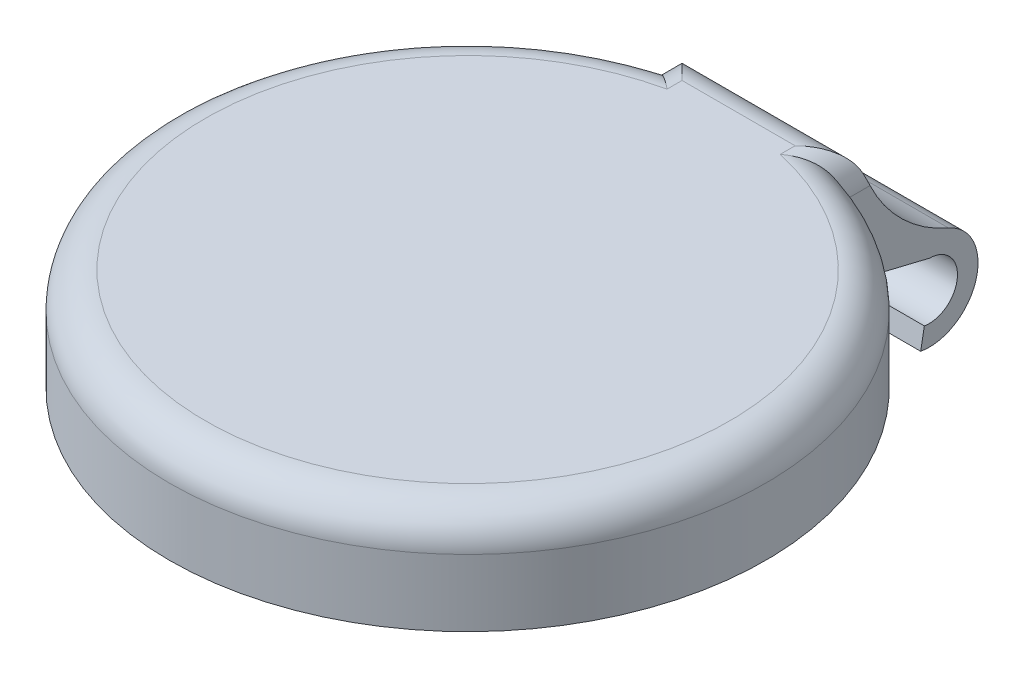
ISO-10303-21;
HEADER;
FILE_DESCRIPTION(('STEP AP214'),'2;1');
FILE_NAME('part.step','',(''),(''),'','','');
FILE_SCHEMA(('AUTOMOTIVE_DESIGN { 1 0 10303 214 1 1 1 1 }'));
ENDSEC;
DATA;
#1=APPLICATION_CONTEXT('core data for automotive mechanical design processes');
#2=APPLICATION_PROTOCOL_DEFINITION('international standard','automotive_design',2000,#1);
#3=PRODUCT_CONTEXT('',#1,'mechanical');
#4=PRODUCT('Part','Part','',(#3));
#5=PRODUCT_RELATED_PRODUCT_CATEGORY('part','',(#4));
#6=PRODUCT_DEFINITION_FORMATION('','',#4);
#7=PRODUCT_DEFINITION_CONTEXT('part definition',#1,'design');
#8=PRODUCT_DEFINITION('design','',#6,#7);
#9=PRODUCT_DEFINITION_SHAPE('','',#8);
#10=(LENGTH_UNIT() NAMED_UNIT(*) SI_UNIT(.MILLI.,.METRE.));
#11=(NAMED_UNIT(*) PLANE_ANGLE_UNIT() SI_UNIT($,.RADIAN.));
#12=(NAMED_UNIT(*) SI_UNIT($,.STERADIAN.) SOLID_ANGLE_UNIT());
#13=UNCERTAINTY_MEASURE_WITH_UNIT(LENGTH_MEASURE(1.E-05),#10,'distance_accuracy_value','');
#14=(GEOMETRIC_REPRESENTATION_CONTEXT(3) GLOBAL_UNCERTAINTY_ASSIGNED_CONTEXT((#13)) GLOBAL_UNIT_ASSIGNED_CONTEXT((#10,
#11,#12)) REPRESENTATION_CONTEXT('',''));
#15=CARTESIAN_POINT('',(0.,0.,0.));
#16=DIRECTION('',(0.,0.,1.));
#17=DIRECTION('',(1.,0.,0.));
#18=AXIS2_PLACEMENT_3D('',#15,#16,#17);
#19=CARTESIAN_POINT('',(0.,10.,0.));
#20=DIRECTION('',(0.,-1.,0.));
#21=DIRECTION('',(0.,0.,-1.));
#22=AXIS2_PLACEMENT_3D('',#19,#20,#21);
#23=CYLINDRICAL_SURFACE('',#22,29.);
#24=DIRECTION('',(0.,-1.,0.));
#25=VECTOR('',#24,1.);
#26=CARTESIAN_POINT('',(9.,10.,-27.5680975041804));
#27=LINE('',#26,#25);
#28=CARTESIAN_POINT('',(9.,6.5,-27.5680975041804));
#29=VERTEX_POINT('',#28);
#30=CARTESIAN_POINT('',(9.,0.,-27.5680975041804));
#31=VERTEX_POINT('',#30);
#32=EDGE_CURVE('E210',#29,#31,#27,.T.);
#33=ORIENTED_EDGE('',*,*,#32,.F.);
#34=CARTESIAN_POINT('',(0.,6.5,0.));
#35=DIRECTION('',(0.,1.,0.));
#36=DIRECTION('',(0.,0.,1.));
#37=AXIS2_PLACEMENT_3D('',#34,#35,#36);
#38=CIRCLE('',#37,29.);
#39=CARTESIAN_POINT('',(-9.,6.5,-27.5680975041804));
#40=VERTEX_POINT('',#39);
#41=EDGE_CURVE('E62',#29,#40,#38,.F.);
#42=ORIENTED_EDGE('',*,*,#41,.T.);
#43=DIRECTION('',(0.,-1.,0.));
#44=VECTOR('',#43,1.);
#45=CARTESIAN_POINT('',(-9.,10.,-27.5680975041804));
#46=LINE('',#45,#44);
#47=CARTESIAN_POINT('',(-9.,0.,-27.5680975041804));
#48=VERTEX_POINT('',#47);
#49=EDGE_CURVE('E207',#40,#48,#46,.T.);
#50=ORIENTED_EDGE('',*,*,#49,.T.);
#51=CARTESIAN_POINT('',(0.,0.,0.));
#52=DIRECTION('',(0.,1.,0.));
#53=DIRECTION('',(0.,0.,1.));
#54=AXIS2_PLACEMENT_3D('',#51,#52,#53);
#55=CIRCLE('',#54,29.);
#56=EDGE_CURVE('E166',#48,#31,#55,.T.);
#57=ORIENTED_EDGE('',*,*,#56,.T.);
#58=EDGE_LOOP('',(#33,#42,#50,#57));
#59=FACE_BOUND('',#58,.T.);
#60=ADVANCED_FACE('F53',(#59),#23,.T.);
#61=CARTESIAN_POINT('',(9.,10.,-27.5680975041804));
#62=DIRECTION('',(-1.,0.,0.));
#63=DIRECTION('',(0.,0.,1.));
#64=AXIS2_PLACEMENT_3D('',#61,#62,#63);
#65=PLANE('',#64);
#66=CARTESIAN_POINT('',(9.,12.8859859390079,-43.7197515318652));
#67=DIRECTION('',(-1.,0.,0.));
#68=DIRECTION('',(0.,0.,1.));
#69=AXIS2_PLACEMENT_3D('',#66,#67,#68);
#70=CIRCLE('',#69,15.);
#71=CARTESIAN_POINT('',(9.,-0.888180596947476,-37.7806997355119));
#72=VERTEX_POINT('',#71);
#73=CARTESIAN_POINT('',(9.,6.5,-30.1470147560048));
#74=VERTEX_POINT('',#73);
#75=EDGE_CURVE('E217',#72,#74,#70,.T.);
#76=ORIENTED_EDGE('',*,*,#75,.T.);
#77=DIRECTION('',(0.,0.,-1.));
#78=VECTOR('',#77,1.);
#79=CARTESIAN_POINT('',(9.,6.5,-27.5680975041804));
#80=LINE('',#79,#78);
#81=EDGE_CURVE('E69',#74,#29,#80,.F.);
#82=ORIENTED_EDGE('',*,*,#81,.T.);
#83=ORIENTED_EDGE('',*,*,#32,.T.);
#84=DIRECTION('',(0.,0.,-1.));
#85=VECTOR('',#84,1.);
#86=CARTESIAN_POINT('',(9.,0.,0.));
#87=LINE('',#86,#85);
#88=CARTESIAN_POINT('',(9.,0.,-25.5680975041804));
#89=VERTEX_POINT('',#88);
#90=EDGE_CURVE('E183',#89,#31,#87,.T.);
#91=ORIENTED_EDGE('',*,*,#90,.F.);
#92=DIRECTION('',(0.,0.235182080678678,0.971951330534429));
#93=VECTOR('',#92,1.);
#94=CARTESIAN_POINT('',(9.,5.84449727846342,-1.41418709691371));
#95=LINE('',#94,#93);
#96=CARTESIAN_POINT('',(9.,-2.5,-35.9));
#97=VERTEX_POINT('',#96);
#98=EDGE_CURVE('E157',#97,#89,#95,.T.);
#99=ORIENTED_EDGE('',*,*,#98,.F.);
#100=CARTESIAN_POINT('',(9.,-5.25,-35.9));
#101=DIRECTION('',(1.,0.,0.));
#102=DIRECTION('',(0.,0.,-1.));
#103=AXIS2_PLACEMENT_3D('',#100,#101,#102);
#104=CIRCLE('',#103,2.75);
#105=CARTESIAN_POINT('',(9.,-7.95822132078358,-35.422467511416));
#106=VERTEX_POINT('',#105);
#107=EDGE_CURVE('E189',#97,#106,#104,.F.);
#108=ORIENTED_EDGE('',*,*,#107,.T.);
#109=DIRECTION('',(0.,-0.98480775301221,0.173648177666921));
#110=VECTOR('',#109,1.);
#111=CARTESIAN_POINT('',(9.,-6.29756844313243,-35.715285419337));
#112=LINE('',#111,#110);
#113=CARTESIAN_POINT('',(9.,-9.927836826808,-35.0751711560821));
#114=VERTEX_POINT('',#113);
#115=EDGE_CURVE('E171',#106,#114,#112,.T.);
#116=ORIENTED_EDGE('',*,*,#115,.T.);
#117=CARTESIAN_POINT('',(9.,-5.25,-35.9));
#118=DIRECTION('',(1.,0.,0.));
#119=DIRECTION('',(0.,0.,-1.));
#120=AXIS2_PLACEMENT_3D('',#117,#118,#119);
#121=CIRCLE('',#120,4.75);
#122=EDGE_CURVE('E180',#72,#114,#121,.F.);
#123=ORIENTED_EDGE('',*,*,#122,.F.);
#124=EDGE_LOOP('',(#76,#82,#83,#91,#99,#108,#116,#123));
#125=FACE_BOUND('',#124,.T.);
#126=ADVANCED_FACE('F309',(#125),#65,.F.);
#127=CARTESIAN_POINT('',(-9.,10.,-27.5680975041804));
#128=DIRECTION('',(1.,0.,0.));
#129=DIRECTION('',(0.,0.,-1.));
#130=AXIS2_PLACEMENT_3D('',#127,#128,#129);
#131=PLANE('',#130);
#132=ORIENTED_EDGE('',*,*,#49,.F.);
#133=DIRECTION('',(0.,0.,1.));
#134=VECTOR('',#133,1.);
#135=CARTESIAN_POINT('',(-9.,6.5,-29.));
#136=LINE('',#135,#134);
#137=CARTESIAN_POINT('',(-9.,6.5,-30.1470147560048));
#138=VERTEX_POINT('',#137);
#139=EDGE_CURVE('E236',#40,#138,#136,.F.);
#140=ORIENTED_EDGE('',*,*,#139,.T.);
#141=CARTESIAN_POINT('',(-9.,12.8859859390079,-43.7197515318652));
#142=DIRECTION('',(1.,0.,0.));
#143=DIRECTION('',(0.,0.,-1.));
#144=AXIS2_PLACEMENT_3D('',#141,#142,#143);
#145=CIRCLE('',#144,15.);
#146=CARTESIAN_POINT('',(-9.,-0.888180596947476,-37.7806997355119));
#147=VERTEX_POINT('',#146);
#148=EDGE_CURVE('E220',#138,#147,#145,.T.);
#149=ORIENTED_EDGE('',*,*,#148,.T.);
#150=CARTESIAN_POINT('',(-9.,-5.25,-35.9));
#151=DIRECTION('',(1.,0.,0.));
#152=DIRECTION('',(0.,0.,-1.));
#153=AXIS2_PLACEMENT_3D('',#150,#151,#152);
#154=CIRCLE('',#153,4.75);
#155=CARTESIAN_POINT('',(-9.,-9.927836826808,-35.0751711560821));
#156=VERTEX_POINT('',#155);
#157=EDGE_CURVE('E168',#147,#156,#154,.F.);
#158=ORIENTED_EDGE('',*,*,#157,.T.);
#159=DIRECTION('',(0.,-0.98480775301221,0.173648177666921));
#160=VECTOR('',#159,1.);
#161=CARTESIAN_POINT('',(-9.,-6.29756844313243,-35.715285419337));
#162=LINE('',#161,#160);
#163=CARTESIAN_POINT('',(-9.,-7.95822132078358,-35.422467511416));
#164=VERTEX_POINT('',#163);
#165=EDGE_CURVE('E162',#164,#156,#162,.T.);
#166=ORIENTED_EDGE('',*,*,#165,.F.);
#167=CARTESIAN_POINT('',(-9.,-5.25,-35.9));
#168=DIRECTION('',(1.,0.,0.));
#169=DIRECTION('',(0.,0.,-1.));
#170=AXIS2_PLACEMENT_3D('',#167,#168,#169);
#171=CIRCLE('',#170,2.75);
#172=CARTESIAN_POINT('',(-9.,-2.5,-35.9));
#173=VERTEX_POINT('',#172);
#174=EDGE_CURVE('E148',#173,#164,#171,.F.);
#175=ORIENTED_EDGE('',*,*,#174,.F.);
#176=DIRECTION('',(0.,0.235182080678678,0.971951330534429));
#177=VECTOR('',#176,1.);
#178=CARTESIAN_POINT('',(-9.,5.84449727846342,-1.41418709691371));
#179=LINE('',#178,#177);
#180=CARTESIAN_POINT('',(-9.,0.,-25.5680975041804));
#181=VERTEX_POINT('',#180);
#182=EDGE_CURVE('E139',#173,#181,#179,.T.);
#183=ORIENTED_EDGE('',*,*,#182,.T.);
#184=DIRECTION('',(0.,0.,-1.));
#185=VECTOR('',#184,1.);
#186=CARTESIAN_POINT('',(-9.,0.,0.));
#187=LINE('',#186,#185);
#188=EDGE_CURVE('E144',#181,#48,#187,.T.);
#189=ORIENTED_EDGE('',*,*,#188,.T.);
#190=EDGE_LOOP('',(#132,#140,#149,#158,#166,#175,#183,#189));
#191=FACE_BOUND('',#190,.T.);
#192=ADVANCED_FACE('F142',(#191),#131,.F.);
#193=CARTESIAN_POINT('',(0.,10.,0.));
#194=DIRECTION('',(0.,1.,0.));
#195=DIRECTION('',(0.,0.,1.));
#196=AXIS2_PLACEMENT_3D('',#193,#194,#195);
#197=PLANE('',#196);
#198=DIRECTION('',(1.,0.,0.));
#199=VECTOR('',#198,1.);
#200=CARTESIAN_POINT('',(-9.,10.,-26.3568835779011));
#201=LINE('',#200,#199);
#202=CARTESIAN_POINT('',(5.5,10.,-26.3568835779011));
#203=VERTEX_POINT('',#202);
#204=CARTESIAN_POINT('',(-5.5,10.,-26.3568835779011));
#205=VERTEX_POINT('',#204);
#206=EDGE_CURVE('E229',#203,#205,#201,.F.);
#207=ORIENTED_EDGE('',*,*,#206,.T.);
#208=DIRECTION('',(0.,0.,1.));
#209=VECTOR('',#208,1.);
#210=CARTESIAN_POINT('',(-5.5,10.,-27.5680975041804));
#211=LINE('',#210,#209);
#212=CARTESIAN_POINT('',(-5.5,10.,-24.8997991959775));
#213=VERTEX_POINT('',#212);
#214=EDGE_CURVE('E232',#205,#213,#211,.T.);
#215=ORIENTED_EDGE('',*,*,#214,.T.);
#216=CARTESIAN_POINT('',(0.,10.,0.));
#217=DIRECTION('',(0.,1.,0.));
#218=DIRECTION('',(0.,0.,1.));
#219=AXIS2_PLACEMENT_3D('',#216,#217,#218);
#220=CIRCLE('',#219,25.5);
#221=CARTESIAN_POINT('',(5.5,10.,-24.8997991959775));
#222=VERTEX_POINT('',#221);
#223=EDGE_CURVE('E223',#213,#222,#220,.T.);
#224=ORIENTED_EDGE('',*,*,#223,.T.);
#225=DIRECTION('',(0.,0.,-1.));
#226=VECTOR('',#225,1.);
#227=CARTESIAN_POINT('',(5.5,10.,-29.));
#228=LINE('',#227,#226);
#229=EDGE_CURVE('E226',#222,#203,#228,.T.);
#230=ORIENTED_EDGE('',*,*,#229,.T.);
#231=EDGE_LOOP('',(#207,#215,#224,#230));
#232=FACE_BOUND('',#231,.T.);
#233=ADVANCED_FACE('F324',(#232),#197,.T.);
#234=CARTESIAN_POINT('',(0.,0.,0.));
#235=DIRECTION('',(0.,1.,0.));
#236=DIRECTION('',(0.,0.,1.));
#237=AXIS2_PLACEMENT_3D('',#234,#235,#236);
#238=PLANE('',#237);
#239=CARTESIAN_POINT('',(0.,0.,0.));
#240=DIRECTION('',(0.,-1.,0.));
#241=DIRECTION('',(0.,0.,-1.));
#242=AXIS2_PLACEMENT_3D('',#239,#240,#241);
#243=CIRCLE('',#242,24.);
#244=CARTESIAN_POINT('',(0.,0.,-24.));
#245=VERTEX_POINT('',#244);
#246=EDGE_CURVE('E285',#245,#245,#243,.T.);
#247=ORIENTED_EDGE('',*,*,#246,.F.);
#248=EDGE_LOOP('',(#247));
#249=FACE_BOUND('',#248,.T.);
#250=DIRECTION('',(1.,0.,0.));
#251=VECTOR('',#250,1.);
#252=CARTESIAN_POINT('',(-9.,0.,-25.5680975041804));
#253=LINE('',#252,#251);
#254=EDGE_CURVE('E154',#181,#89,#253,.T.);
#255=ORIENTED_EDGE('',*,*,#254,.T.);
#256=ORIENTED_EDGE('',*,*,#90,.T.);
#257=ORIENTED_EDGE('',*,*,#56,.F.);
#258=ORIENTED_EDGE('',*,*,#188,.F.);
#259=EDGE_LOOP('',(#255,#256,#257,#258));
#260=FACE_BOUND('',#259,.T.);
#261=ADVANCED_FACE('F164',(#249,#260),#238,.F.);
#262=CARTESIAN_POINT('',(-9.,-5.25,-35.9));
#263=DIRECTION('',(1.,0.,0.));
#264=DIRECTION('',(0.,0.,-1.));
#265=AXIS2_PLACEMENT_3D('',#262,#263,#264);
#266=CYLINDRICAL_SURFACE('',#265,4.75);
#267=ORIENTED_EDGE('',*,*,#157,.F.);
#268=DIRECTION('',(1.,0.,0.));
#269=VECTOR('',#268,1.);
#270=CARTESIAN_POINT('',(-9.,-0.888180596947476,-37.7806997355119));
#271=LINE('',#270,#269);
#272=EDGE_CURVE('E213',#147,#72,#271,.T.);
#273=ORIENTED_EDGE('',*,*,#272,.T.);
#274=ORIENTED_EDGE('',*,*,#122,.T.);
#275=DIRECTION('',(1.,0.,0.));
#276=VECTOR('',#275,1.);
#277=CARTESIAN_POINT('',(-9.,-9.927836826808,-35.0751711560821));
#278=LINE('',#277,#276);
#279=EDGE_CURVE('E196',#156,#114,#278,.T.);
#280=ORIENTED_EDGE('',*,*,#279,.F.);
#281=EDGE_LOOP('',(#267,#273,#274,#280));
#282=FACE_BOUND('',#281,.T.);
#283=ADVANCED_FACE('F314',(#282),#266,.T.);
#284=CARTESIAN_POINT('',(-9.,-6.29756844313243,-35.715285419337));
#285=DIRECTION('',(0.,0.173648177666921,0.98480775301221));
#286=DIRECTION('',(0.,-0.98480775301221,0.173648177666921));
#287=AXIS2_PLACEMENT_3D('',#284,#285,#286);
#288=PLANE('',#287);
#289=ORIENTED_EDGE('',*,*,#115,.F.);
#290=DIRECTION('',(1.,0.,0.));
#291=VECTOR('',#290,1.);
#292=CARTESIAN_POINT('',(-9.,-7.95822132078358,-35.422467511416));
#293=LINE('',#292,#291);
#294=EDGE_CURVE('E200',#164,#106,#293,.T.);
#295=ORIENTED_EDGE('',*,*,#294,.F.);
#296=ORIENTED_EDGE('',*,*,#165,.T.);
#297=ORIENTED_EDGE('',*,*,#279,.T.);
#298=EDGE_LOOP('',(#289,#295,#296,#297));
#299=FACE_BOUND('',#298,.T.);
#300=ADVANCED_FACE('F316',(#299),#288,.T.);
#301=CARTESIAN_POINT('',(-9.,-5.25,-35.9));
#302=DIRECTION('',(1.,0.,0.));
#303=DIRECTION('',(0.,0.,-1.));
#304=AXIS2_PLACEMENT_3D('',#301,#302,#303);
#305=CYLINDRICAL_SURFACE('',#304,2.75);
#306=ORIENTED_EDGE('',*,*,#107,.F.);
#307=DIRECTION('',(1.,0.,0.));
#308=VECTOR('',#307,1.);
#309=CARTESIAN_POINT('',(-9.,-2.5,-35.9));
#310=LINE('',#309,#308);
#311=EDGE_CURVE('E161',#173,#97,#310,.T.);
#312=ORIENTED_EDGE('',*,*,#311,.F.);
#313=ORIENTED_EDGE('',*,*,#174,.T.);
#314=ORIENTED_EDGE('',*,*,#294,.T.);
#315=EDGE_LOOP('',(#306,#312,#313,#314));
#316=FACE_BOUND('',#315,.T.);
#317=ADVANCED_FACE('F343',(#316),#305,.F.);
#318=CARTESIAN_POINT('',(-9.,5.84449727846342,-1.41418709691371));
#319=DIRECTION('',(0.,0.971951330534429,-0.235182080678678));
#320=DIRECTION('',(0.,0.235182080678678,0.971951330534429));
#321=AXIS2_PLACEMENT_3D('',#318,#319,#320);
#322=PLANE('',#321);
#323=ORIENTED_EDGE('',*,*,#98,.T.);
#324=ORIENTED_EDGE('',*,*,#254,.F.);
#325=ORIENTED_EDGE('',*,*,#182,.F.);
#326=ORIENTED_EDGE('',*,*,#311,.T.);
#327=EDGE_LOOP('',(#323,#324,#325,#326));
#328=FACE_BOUND('',#327,.T.);
#329=ADVANCED_FACE('F155',(#328),#322,.F.);
#330=CARTESIAN_POINT('',(-9.,12.8859859390079,-43.7197515318652));
#331=DIRECTION('',(-1.,0.,0.));
#332=DIRECTION('',(0.,0.,1.));
#333=AXIS2_PLACEMENT_3D('',#330,#331,#332);
#334=CYLINDRICAL_SURFACE('',#333,15.);
#335=ORIENTED_EDGE('',*,*,#148,.F.);
#336=CARTESIAN_POINT('',(-9.,6.5,-30.1470147560048));
#337=CARTESIAN_POINT('',(-9.00000840723424,6.60090979215177,-30.0995241486243));
#338=CARTESIAN_POINT('',(-8.99563506539931,6.70237845387515,-30.0531702472135));
#339=CARTESIAN_POINT('',(-8.97797204439329,6.90491441432685,-29.9633390619673));
#340=CARTESIAN_POINT('',(-8.96474780652322,7.0059792214118,-29.9198432198844));
#341=CARTESIAN_POINT('',(-8.92923434531926,7.20769704888034,-29.8356246855853));
#342=CARTESIAN_POINT('',(-8.90694421131473,7.3083500268694,-29.7949022724405));
#343=CARTESIAN_POINT('',(-8.85300321865056,7.50909644840812,-29.7161497918298));
#344=CARTESIAN_POINT('',(-8.82128460268405,7.60918030566861,-29.678141771393));
#345=CARTESIAN_POINT('',(-8.78486691020943,7.70815950197446,-29.6417504881106));
#346=B_SPLINE_CURVE_WITH_KNOTS('',3,(#336,#337,#338,#339,#340,#341,#342,#343,#344,#345),
.UNSPECIFIED.,.F.,.F.,(4,2,2,2,4),(0.,0.334517776748931,0.666589141559774,0.998693871230997,
1.33324545889248),.UNSPECIFIED.);
#347=CARTESIAN_POINT('',(-8.78486691020943,7.70815950197446,-29.6417504881106));
#348=VERTEX_POINT('',#347);
#349=EDGE_CURVE('E77',#138,#348,#346,.T.);
#350=ORIENTED_EDGE('',*,*,#349,.T.);
#351=DIRECTION('',(-1.,0.,0.));
#352=VECTOR('',#351,1.);
#353=CARTESIAN_POINT('',(-9.,7.70815950197446,-29.6417504881106));
#354=LINE('',#353,#352);
#355=CARTESIAN_POINT('',(8.78486691020943,7.70815950197446,-29.6417504881106));
#356=VERTEX_POINT('',#355);
#357=EDGE_CURVE('E249',#348,#356,#354,.F.);
#358=ORIENTED_EDGE('',*,*,#357,.T.);
#359=CARTESIAN_POINT('',(8.78486691020943,7.70815950197446,-29.6417504881106));
#360=CARTESIAN_POINT('',(8.82128460268405,7.60918030566861,-29.678141771393));
#361=CARTESIAN_POINT('',(8.85300321865056,7.50909644840812,-29.7161497918298));
#362=CARTESIAN_POINT('',(8.90694421131473,7.3083500268694,-29.7949022724405));
#363=CARTESIAN_POINT('',(8.92923434531926,7.20769704888034,-29.8356246855853));
#364=CARTESIAN_POINT('',(8.96474780652322,7.0059792214118,-29.9198432198844));
#365=CARTESIAN_POINT('',(8.97797204439329,6.90491441432685,-29.9633390619673));
#366=CARTESIAN_POINT('',(8.99563506539931,6.70237845387515,-30.0531702472135));
#367=CARTESIAN_POINT('',(9.00000840723424,6.60090979215177,-30.0995241486243));
#368=CARTESIAN_POINT('',(9.,6.5,-30.1470147560048));
#369=B_SPLINE_CURVE_WITH_KNOTS('',3,(#359,#360,#361,#362,#363,#364,#365,#366,#367,#368),
.UNSPECIFIED.,.F.,.F.,(4,2,2,2,4),(0.,0.334551587661482,0.666656317332709,0.998727682143552,
1.33324545889249),.UNSPECIFIED.);
#370=EDGE_CURVE('E240',#356,#74,#369,.T.);
#371=ORIENTED_EDGE('',*,*,#370,.T.);
#372=ORIENTED_EDGE('',*,*,#75,.F.);
#373=ORIENTED_EDGE('',*,*,#272,.F.);
#374=EDGE_LOOP('',(#335,#350,#358,#371,#372,#373));
#375=FACE_BOUND('',#374,.T.);
#376=ADVANCED_FACE('F254',(#375),#334,.F.);
#377=CARTESIAN_POINT('',(5.5,6.5,0.));
#378=DIRECTION('',(0.,0.,1.));
#379=DIRECTION('',(1.,0.,0.));
#380=AXIS2_PLACEMENT_3D('',#377,#378,#379);
#381=CYLINDRICAL_SURFACE('',#380,3.5);
#382=ORIENTED_EDGE('',*,*,#81,.F.);
#383=ORIENTED_EDGE('',*,*,#370,.F.);
#384=CARTESIAN_POINT('',(5.5,6.5,-26.3568835779011));
#385=DIRECTION('',(0.707106781186547,0.,0.707106781186547));
#386=DIRECTION('',(-0.707106781186547,0.,0.707106781186547));
#387=AXIS2_PLACEMENT_3D('',#384,#385,#386);
#388=ELLIPSE('',#387,4.94974746830583,3.5);
#389=EDGE_CURVE('E184',#203,#356,#388,.F.);
#390=ORIENTED_EDGE('',*,*,#389,.F.);
#391=ORIENTED_EDGE('',*,*,#229,.F.);
#392=CARTESIAN_POINT('',(9.,6.5,-27.5680975041804));
#393=CARTESIAN_POINT('',(9.00001678607858,6.58491104718864,-27.5681085544919));
#394=CARTESIAN_POINT('',(8.99691054088114,6.66981191221889,-27.5658561485135));
#395=CARTESIAN_POINT('',(8.98458042781979,6.83889614029683,-27.556909361826));
#396=CARTESIAN_POINT('',(8.97535926478372,6.92307980391815,-27.5502169450781));
#397=CARTESIAN_POINT('',(8.95099366596753,7.08965670151117,-27.5325229514668));
#398=CARTESIAN_POINT('',(8.93588156016726,7.17205716002885,-27.5215448940829));
#399=CARTESIAN_POINT('',(8.89998051379552,7.33492316737796,-27.4954430816438));
#400=CARTESIAN_POINT('',(8.87919120419469,7.4153885900582,-27.4803190570923));
#401=CARTESIAN_POINT('',(8.80879665985641,7.65282906372622,-27.4290547370359));
#402=CARTESIAN_POINT('',(8.75110645081355,7.8062355562288,-27.3869799836773));
#403=CARTESIAN_POINT('',(8.61711847022133,8.09991508763825,-27.2889561642368));
#404=CARTESIAN_POINT('',(8.54079922668778,8.24017271098827,-27.2329910867886));
#405=CARTESIAN_POINT('',(8.36736659735383,8.51398196806619,-27.1053313057411));
#406=CARTESIAN_POINT('',(8.26922884634109,8.64651608495815,-27.0328543646098));
#407=CARTESIAN_POINT('',(8.05928999410618,8.89296483138142,-26.8770844897021));
#408=CARTESIAN_POINT('',(7.94748531201923,9.00687456279508,-26.7937887209318));
#409=CARTESIAN_POINT('',(7.69247071156743,9.23446084610196,-26.6028096809539));
#410=CARTESIAN_POINT('',(7.54722528226417,9.34442838609506,-26.4934322557025));
#411=CARTESIAN_POINT('',(7.24671661387671,9.53825849911598,-26.2655987413967));
#412=CARTESIAN_POINT('',(7.09144300102345,9.62209349946867,-26.1471332264838));
#413=CARTESIAN_POINT('',(6.74222935763098,9.77880933180247,-25.8787679532676));
#414=CARTESIAN_POINT('',(6.54686377226035,9.84596567077703,-25.7273860314567));
#415=CARTESIAN_POINT('',(6.15226468154436,9.94468691577814,-25.4187797715872));
#416=CARTESIAN_POINT('',(5.95303590090846,9.97629281274816,-25.2615623786486));
#417=CARTESIAN_POINT('',(5.67234865416313,9.9967108182077,-25.0379351730203));
#418=CARTESIAN_POINT('',(5.59078050055023,9.9997703377428,-24.9726950391046));
#419=CARTESIAN_POINT('',(5.50622377094273,9.99999584866725,-24.9047978723133));
#420=CARTESIAN_POINT('',(5.50311179241608,9.9999999985121,-24.9022986473488));
#421=CARTESIAN_POINT('',(5.5,10.,-24.8997991959775));
#422=B_SPLINE_CURVE_WITH_KNOTS('',3,(#392,#393,#394,#395,#396,#397,#398,#399,#400,#401,#402,
#403,#404,#405,#406,#407,#408,#409,#410,#411,#412,#413,#414,#415,#416,#417,#418,#419,#420,#421),
.UNSPECIFIED.,.F.,.F.,(4,2,2,2,2,2,2,2,2,2,2,2,2,2,4),(0.,0.254629634892146,0.509146713843669,
0.762286213581539,1.01544217179994,1.5205877528291,2.02631834131258,2.56469859639159,
3.10322021574752,3.73836660090022,4.37418088387361,5.13971487075764,5.90436526155608,
6.21772037493133,6.22969429684608),.UNSPECIFIED.);
#423=EDGE_CURVE('E289',#29,#222,#422,.T.);
#424=ORIENTED_EDGE('',*,*,#423,.F.);
#425=EDGE_LOOP('',(#382,#383,#390,#391,#424));
#426=FACE_BOUND('',#425,.T.);
#427=ADVANCED_FACE('F251',(#426),#381,.T.);
#428=CARTESIAN_POINT('',(-9.,6.5,-26.3568835779011));
#429=DIRECTION('',(-1.,0.,0.));
#430=DIRECTION('',(0.,0.,1.));
#431=AXIS2_PLACEMENT_3D('',#428,#429,#430);
#432=CYLINDRICAL_SURFACE('',#431,3.5);
#433=ORIENTED_EDGE('',*,*,#389,.T.);
#434=ORIENTED_EDGE('',*,*,#357,.F.);
#435=CARTESIAN_POINT('',(-5.5,6.5,-26.3568835779011));
#436=DIRECTION('',(-0.707106781186547,0.,0.707106781186547));
#437=DIRECTION('',(-0.707106781186547,0.,-0.707106781186547));
#438=AXIS2_PLACEMENT_3D('',#435,#436,#437);
#439=ELLIPSE('',#438,4.94974746830583,3.5);
#440=EDGE_CURVE('E284',#205,#348,#439,.T.);
#441=ORIENTED_EDGE('',*,*,#440,.F.);
#442=ORIENTED_EDGE('',*,*,#206,.F.);
#443=EDGE_LOOP('',(#433,#434,#441,#442));
#444=FACE_BOUND('',#443,.T.);
#445=ADVANCED_FACE('F301',(#444),#432,.T.);
#446=CARTESIAN_POINT('',(0.,6.5,0.));
#447=DIRECTION('',(0.,1.,0.));
#448=DIRECTION('',(0.,0.,1.));
#449=AXIS2_PLACEMENT_3D('',#446,#447,#448);
#450=TOROIDAL_SURFACE('',#449,25.5,3.5);
#451=ORIENTED_EDGE('',*,*,#423,.T.);
#452=ORIENTED_EDGE('',*,*,#223,.F.);
#453=CARTESIAN_POINT('',(-9.,6.5,-27.5680975041804));
#454=CARTESIAN_POINT('',(-9.00001678607858,6.58491104718864,-27.5681085544919));
#455=CARTESIAN_POINT('',(-8.99691054088114,6.66981191221889,-27.5658561485135));
#456=CARTESIAN_POINT('',(-8.98458042781979,6.83889614029683,-27.556909361826));
#457=CARTESIAN_POINT('',(-8.97535926478372,6.92307980391815,-27.5502169450781));
#458=CARTESIAN_POINT('',(-8.95099366596753,7.08965670151117,-27.5325229514668));
#459=CARTESIAN_POINT('',(-8.93588156016726,7.17205716002885,-27.5215448940829));
#460=CARTESIAN_POINT('',(-8.89998051379552,7.33492316737796,-27.4954430816438));
#461=CARTESIAN_POINT('',(-8.87919120419469,7.4153885900582,-27.4803190570923));
#462=CARTESIAN_POINT('',(-8.80879665985641,7.65282906372622,-27.4290547370359));
#463=CARTESIAN_POINT('',(-8.75110645081355,7.8062355562288,-27.3869799836773));
#464=CARTESIAN_POINT('',(-8.61711847022133,8.09991508763825,-27.2889561642368));
#465=CARTESIAN_POINT('',(-8.54079922668778,8.24017271098827,-27.2329910867886));
#466=CARTESIAN_POINT('',(-8.36736659735383,8.51398196806619,-27.1053313057411));
#467=CARTESIAN_POINT('',(-8.26922884634109,8.64651608495815,-27.0328543646098));
#468=CARTESIAN_POINT('',(-8.05928999410618,8.89296483138142,-26.8770844897021));
#469=CARTESIAN_POINT('',(-7.94748531201923,9.00687456279508,-26.7937887209318));
#470=CARTESIAN_POINT('',(-7.69247071156743,9.23446084610196,-26.6028096809539));
#471=CARTESIAN_POINT('',(-7.54722528226417,9.34442838609506,-26.4934322557025));
#472=CARTESIAN_POINT('',(-7.24671661387671,9.53825849911598,-26.2655987413967));
#473=CARTESIAN_POINT('',(-7.09144300102345,9.62209349946867,-26.1471332264838));
#474=CARTESIAN_POINT('',(-6.74222935763098,9.77880933180247,-25.8787679532676));
#475=CARTESIAN_POINT('',(-6.54686377226035,9.84596567077703,-25.7273860314567));
#476=CARTESIAN_POINT('',(-6.15226468154436,9.94468691577814,-25.4187797715872));
#477=CARTESIAN_POINT('',(-5.95303590090846,9.97629281274816,-25.2615623786486));
#478=CARTESIAN_POINT('',(-5.67234865416313,9.9967108182077,-25.0379351730203));
#479=CARTESIAN_POINT('',(-5.59078050055023,9.9997703377428,-24.9726950391046));
#480=CARTESIAN_POINT('',(-5.50622377094273,9.99999584866725,-24.9047978723133));
#481=CARTESIAN_POINT('',(-5.50311179241608,9.9999999985121,-24.9022986473488));
#482=CARTESIAN_POINT('',(-5.5,10.,-24.8997991959775));
#483=B_SPLINE_CURVE_WITH_KNOTS('',3,(#453,#454,#455,#456,#457,#458,#459,#460,#461,#462,#463,
#464,#465,#466,#467,#468,#469,#470,#471,#472,#473,#474,#475,#476,#477,#478,#479,#480,#481,#482),
.UNSPECIFIED.,.F.,.F.,(4,2,2,2,2,2,2,2,2,2,2,2,2,2,4),(0.,0.254629634892146,0.509146713843669,
0.762286213581539,1.01544217179994,1.5205877528291,2.02631834131258,2.56469859639159,
3.10322021574752,3.73836660090022,4.37418088387361,5.13971487075764,5.90436526155608,
6.21772037493133,6.22969429684608),.UNSPECIFIED.);
#484=EDGE_CURVE('E277',#40,#213,#483,.T.);
#485=ORIENTED_EDGE('',*,*,#484,.F.);
#486=ORIENTED_EDGE('',*,*,#41,.F.);
#487=EDGE_LOOP('',(#451,#452,#485,#486));
#488=FACE_BOUND('',#487,.T.);
#489=ADVANCED_FACE('F260',(#488),#450,.T.);
#490=CARTESIAN_POINT('',(-5.5,6.5,0.));
#491=DIRECTION('',(0.,0.,-1.));
#492=DIRECTION('',(-1.,0.,0.));
#493=AXIS2_PLACEMENT_3D('',#490,#491,#492);
#494=CYLINDRICAL_SURFACE('',#493,3.5);
#495=ORIENTED_EDGE('',*,*,#349,.F.);
#496=ORIENTED_EDGE('',*,*,#139,.F.);
#497=ORIENTED_EDGE('',*,*,#484,.T.);
#498=ORIENTED_EDGE('',*,*,#214,.F.);
#499=ORIENTED_EDGE('',*,*,#440,.T.);
#500=EDGE_LOOP('',(#495,#496,#497,#498,#499));
#501=FACE_BOUND('',#500,.T.);
#502=ADVANCED_FACE('F270',(#501),#494,.T.);
#503=CARTESIAN_POINT('',(0.,5.,0.));
#504=DIRECTION('',(0.,1.,0.));
#505=DIRECTION('',(0.,0.,1.));
#506=AXIS2_PLACEMENT_3D('',#503,#504,#505);
#507=PLANE('',#506);
#508=CARTESIAN_POINT('',(0.,5.,0.));
#509=DIRECTION('',(0.,1.,0.));
#510=DIRECTION('',(0.,0.,1.));
#511=AXIS2_PLACEMENT_3D('',#508,#509,#510);
#512=CIRCLE('',#511,12.8196601125011);
#513=CARTESIAN_POINT('',(0.,5.,12.8196601125011));
#514=VERTEX_POINT('',#513);
#515=EDGE_CURVE('E12',#514,#514,#512,.F.);
#516=ORIENTED_EDGE('',*,*,#515,.T.);
#517=EDGE_LOOP('',(#516));
#518=FACE_BOUND('',#517,.T.);
#519=ADVANCED_FACE('F273',(#518),#507,.F.);
#520=CARTESIAN_POINT('',(0.,-10.,0.));
#521=DIRECTION('',(0.,-1.,0.));
#522=DIRECTION('',(0.,0.,-1.));
#523=AXIS2_PLACEMENT_3D('',#520,#521,#522);
#524=DEGENERATE_TOROIDAL_SURFACE('',#523,12.8196601125011,15.,.T.);
#525=ORIENTED_EDGE('',*,*,#246,.T.);
#526=EDGE_LOOP('',(#525));
#527=FACE_BOUND('',#526,.T.);
#528=ORIENTED_EDGE('',*,*,#515,.F.);
#529=EDGE_LOOP('',(#528));
#530=FACE_BOUND('',#529,.T.);
#531=ADVANCED_FACE('F55',(#527,#530),#524,.F.);
#532=CLOSED_SHELL('',(#60,#126,#192,#233,#261,#283,#300,#317,#329,#376,#427,#445,#489,#502,#519,#531));
#533=MANIFOLD_SOLID_BREP('B2',#532);
#534=ADVANCED_BREP_SHAPE_REPRESENTATION('',(#18,#533),#14);
#535=SHAPE_DEFINITION_REPRESENTATION(#9,#534);
ENDSEC;
END-ISO-10303-21;
